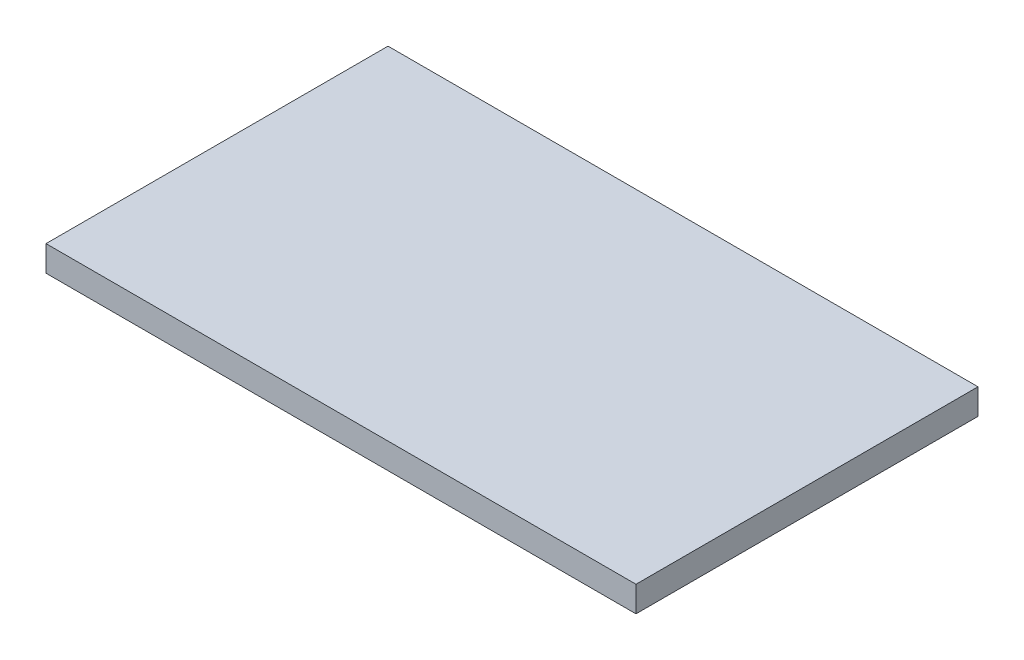
ISO-10303-21;
HEADER;
FILE_DESCRIPTION(('STEP AP214'),'2;1');
FILE_NAME('part.step','',(''),(''),'','','');
FILE_SCHEMA(('AUTOMOTIVE_DESIGN { 1 0 10303 214 1 1 1 1 }'));
ENDSEC;
DATA;
#1=APPLICATION_CONTEXT('core data for automotive mechanical design processes');
#2=APPLICATION_PROTOCOL_DEFINITION('international standard','automotive_design',2000,#1);
#3=PRODUCT_CONTEXT('',#1,'mechanical');
#4=PRODUCT('Part','Part','',(#3));
#5=PRODUCT_RELATED_PRODUCT_CATEGORY('part','',(#4));
#6=PRODUCT_DEFINITION_FORMATION('','',#4);
#7=PRODUCT_DEFINITION_CONTEXT('part definition',#1,'design');
#8=PRODUCT_DEFINITION('design','',#6,#7);
#9=PRODUCT_DEFINITION_SHAPE('','',#8);
#10=(LENGTH_UNIT() NAMED_UNIT(*) SI_UNIT(.MILLI.,.METRE.));
#11=(NAMED_UNIT(*) PLANE_ANGLE_UNIT() SI_UNIT($,.RADIAN.));
#12=(NAMED_UNIT(*) SI_UNIT($,.STERADIAN.) SOLID_ANGLE_UNIT());
#13=UNCERTAINTY_MEASURE_WITH_UNIT(LENGTH_MEASURE(1.E-05),#10,'distance_accuracy_value','');
#14=(GEOMETRIC_REPRESENTATION_CONTEXT(3) GLOBAL_UNCERTAINTY_ASSIGNED_CONTEXT((#13)) GLOBAL_UNIT_ASSIGNED_CONTEXT((#10,
#11,#12)) REPRESENTATION_CONTEXT('',''));
#15=CARTESIAN_POINT('',(0.,0.,0.));
#16=DIRECTION('',(0.,0.,1.));
#17=DIRECTION('',(1.,0.,0.));
#18=AXIS2_PLACEMENT_3D('',#15,#16,#17);
#19=CARTESIAN_POINT('',(0.,0.,160.));
#20=DIRECTION('',(0.,0.,1.));
#21=DIRECTION('',(1.,0.,0.));
#22=AXIS2_PLACEMENT_3D('',#19,#20,#21);
#23=PLANE('',#22);
#24=DIRECTION('',(0.,1.,0.));
#25=VECTOR('',#24,1.);
#26=CARTESIAN_POINT('',(0.,0.,160.));
#27=LINE('',#26,#25);
#28=CARTESIAN_POINT('',(0.,0.,160.));
#29=VERTEX_POINT('',#28);
#30=CARTESIAN_POINT('',(0.,12.,160.));
#31=VERTEX_POINT('',#30);
#32=EDGE_CURVE('E87',#29,#31,#27,.T.);
#33=ORIENTED_EDGE('',*,*,#32,.F.);
#34=DIRECTION('',(1.,0.,0.));
#35=VECTOR('',#34,1.);
#36=CARTESIAN_POINT('',(0.,0.,160.));
#37=LINE('',#36,#35);
#38=CARTESIAN_POINT('',(276.,0.,160.));
#39=VERTEX_POINT('',#38);
#40=EDGE_CURVE('E75',#29,#39,#37,.T.);
#41=ORIENTED_EDGE('',*,*,#40,.T.);
#42=DIRECTION('',(0.,1.,0.));
#43=VECTOR('',#42,1.);
#44=CARTESIAN_POINT('',(276.,0.,160.));
#45=LINE('',#44,#43);
#46=CARTESIAN_POINT('',(276.,12.,160.));
#47=VERTEX_POINT('',#46);
#48=EDGE_CURVE('E85',#39,#47,#45,.T.);
#49=ORIENTED_EDGE('',*,*,#48,.T.);
#50=DIRECTION('',(1.,0.,0.));
#51=VECTOR('',#50,1.);
#52=CARTESIAN_POINT('',(0.,12.,160.));
#53=LINE('',#52,#51);
#54=EDGE_CURVE('E10',#31,#47,#53,.T.);
#55=ORIENTED_EDGE('',*,*,#54,.F.);
#56=EDGE_LOOP('',(#33,#41,#49,#55));
#57=FACE_BOUND('',#56,.T.);
#58=ADVANCED_FACE('F16',(#57),#23,.T.);
#59=CARTESIAN_POINT('',(0.,0.,0.));
#60=DIRECTION('',(0.,0.,1.));
#61=DIRECTION('',(1.,0.,0.));
#62=AXIS2_PLACEMENT_3D('',#59,#60,#61);
#63=PLANE('',#62);
#64=DIRECTION('',(1.,0.,0.));
#65=VECTOR('',#64,1.);
#66=CARTESIAN_POINT('',(0.,12.,0.));
#67=LINE('',#66,#65);
#68=CARTESIAN_POINT('',(0.,12.,0.));
#69=VERTEX_POINT('',#68);
#70=CARTESIAN_POINT('',(276.,12.,0.));
#71=VERTEX_POINT('',#70);
#72=EDGE_CURVE('E25',#69,#71,#67,.T.);
#73=ORIENTED_EDGE('',*,*,#72,.T.);
#74=DIRECTION('',(0.,1.,0.));
#75=VECTOR('',#74,1.);
#76=CARTESIAN_POINT('',(276.,0.,0.));
#77=LINE('',#76,#75);
#78=CARTESIAN_POINT('',(276.,0.,0.));
#79=VERTEX_POINT('',#78);
#80=EDGE_CURVE('E110',#79,#71,#77,.T.);
#81=ORIENTED_EDGE('',*,*,#80,.F.);
#82=DIRECTION('',(1.,0.,0.));
#83=VECTOR('',#82,1.);
#84=CARTESIAN_POINT('',(0.,0.,0.));
#85=LINE('',#84,#83);
#86=CARTESIAN_POINT('',(0.,0.,0.));
#87=VERTEX_POINT('',#86);
#88=EDGE_CURVE('E19',#87,#79,#85,.T.);
#89=ORIENTED_EDGE('',*,*,#88,.F.);
#90=DIRECTION('',(0.,1.,0.));
#91=VECTOR('',#90,1.);
#92=CARTESIAN_POINT('',(0.,0.,0.));
#93=LINE('',#92,#91);
#94=EDGE_CURVE('E86',#87,#69,#93,.T.);
#95=ORIENTED_EDGE('',*,*,#94,.T.);
#96=EDGE_LOOP('',(#73,#81,#89,#95));
#97=FACE_BOUND('',#96,.T.);
#98=ADVANCED_FACE('F119',(#97),#63,.F.);
#99=CARTESIAN_POINT('',(0.,12.,0.));
#100=DIRECTION('',(0.,1.,0.));
#101=DIRECTION('',(1.,0.,0.));
#102=AXIS2_PLACEMENT_3D('',#99,#100,#101);
#103=PLANE('',#102);
#104=ORIENTED_EDGE('',*,*,#72,.F.);
#105=DIRECTION('',(0.,0.,1.));
#106=VECTOR('',#105,1.);
#107=CARTESIAN_POINT('',(0.,12.,0.));
#108=LINE('',#107,#106);
#109=EDGE_CURVE('E95',#69,#31,#108,.T.);
#110=ORIENTED_EDGE('',*,*,#109,.T.);
#111=ORIENTED_EDGE('',*,*,#54,.T.);
#112=DIRECTION('',(0.,0.,1.));
#113=VECTOR('',#112,1.);
#114=CARTESIAN_POINT('',(276.,12.,0.));
#115=LINE('',#114,#113);
#116=EDGE_CURVE('E101',#71,#47,#115,.T.);
#117=ORIENTED_EDGE('',*,*,#116,.F.);
#118=EDGE_LOOP('',(#104,#110,#111,#117));
#119=FACE_BOUND('',#118,.T.);
#120=ADVANCED_FACE('F117',(#119),#103,.T.);
#121=CARTESIAN_POINT('',(0.,0.,0.));
#122=DIRECTION('',(0.,1.,0.));
#123=DIRECTION('',(1.,0.,0.));
#124=AXIS2_PLACEMENT_3D('',#121,#122,#123);
#125=PLANE('',#124);
#126=DIRECTION('',(0.,0.,1.));
#127=VECTOR('',#126,1.);
#128=CARTESIAN_POINT('',(276.,0.,0.));
#129=LINE('',#128,#127);
#130=EDGE_CURVE('E80',#79,#39,#129,.T.);
#131=ORIENTED_EDGE('',*,*,#130,.T.);
#132=ORIENTED_EDGE('',*,*,#40,.F.);
#133=DIRECTION('',(0.,0.,1.));
#134=VECTOR('',#133,1.);
#135=CARTESIAN_POINT('',(0.,0.,0.));
#136=LINE('',#135,#134);
#137=EDGE_CURVE('E72',#87,#29,#136,.T.);
#138=ORIENTED_EDGE('',*,*,#137,.F.);
#139=ORIENTED_EDGE('',*,*,#88,.T.);
#140=EDGE_LOOP('',(#131,#132,#138,#139));
#141=FACE_BOUND('',#140,.T.);
#142=ADVANCED_FACE('F73',(#141),#125,.F.);
#143=CARTESIAN_POINT('',(276.,0.,0.));
#144=DIRECTION('',(1.,0.,0.));
#145=DIRECTION('',(0.,1.,0.));
#146=AXIS2_PLACEMENT_3D('',#143,#144,#145);
#147=PLANE('',#146);
#148=ORIENTED_EDGE('',*,*,#130,.F.);
#149=ORIENTED_EDGE('',*,*,#80,.T.);
#150=ORIENTED_EDGE('',*,*,#116,.T.);
#151=ORIENTED_EDGE('',*,*,#48,.F.);
#152=EDGE_LOOP('',(#148,#149,#150,#151));
#153=FACE_BOUND('',#152,.T.);
#154=ADVANCED_FACE('F116',(#153),#147,.T.);
#155=CARTESIAN_POINT('',(0.,0.,0.));
#156=DIRECTION('',(1.,0.,0.));
#157=DIRECTION('',(0.,1.,0.));
#158=AXIS2_PLACEMENT_3D('',#155,#156,#157);
#159=PLANE('',#158);
#160=ORIENTED_EDGE('',*,*,#32,.T.);
#161=ORIENTED_EDGE('',*,*,#109,.F.);
#162=ORIENTED_EDGE('',*,*,#94,.F.);
#163=ORIENTED_EDGE('',*,*,#137,.T.);
#164=EDGE_LOOP('',(#160,#161,#162,#163));
#165=FACE_BOUND('',#164,.T.);
#166=ADVANCED_FACE('F84',(#165),#159,.F.);
#167=CLOSED_SHELL('',(#58,#98,#120,#142,#154,#166));
#168=MANIFOLD_SOLID_BREP('B1',#167);
#169=ADVANCED_BREP_SHAPE_REPRESENTATION('',(#18,#168),#14);
#170=SHAPE_DEFINITION_REPRESENTATION(#9,#169);
ENDSEC;
END-ISO-10303-21;
